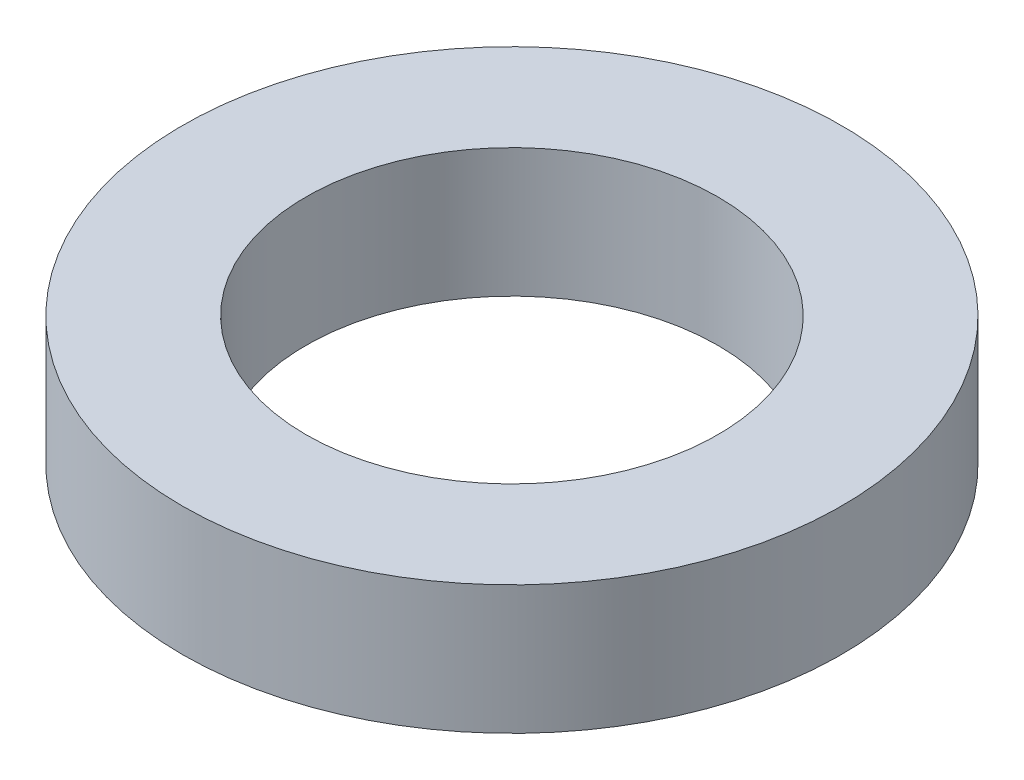
ISO-10303-21;
HEADER;
FILE_DESCRIPTION(('STEP AP214'),'2;1');
FILE_NAME('part.step','',(''),(''),'','','');
FILE_SCHEMA(('AUTOMOTIVE_DESIGN { 1 0 10303 214 1 1 1 1 }'));
ENDSEC;
DATA;
#1=APPLICATION_CONTEXT('core data for automotive mechanical design processes');
#2=APPLICATION_PROTOCOL_DEFINITION('international standard','automotive_design',2000,#1);
#3=PRODUCT_CONTEXT('',#1,'mechanical');
#4=PRODUCT('Part','Part','',(#3));
#5=PRODUCT_RELATED_PRODUCT_CATEGORY('part','',(#4));
#6=PRODUCT_DEFINITION_FORMATION('','',#4);
#7=PRODUCT_DEFINITION_CONTEXT('part definition',#1,'design');
#8=PRODUCT_DEFINITION('design','',#6,#7);
#9=PRODUCT_DEFINITION_SHAPE('','',#8);
#10=(LENGTH_UNIT() NAMED_UNIT(*) SI_UNIT(.MILLI.,.METRE.));
#11=(NAMED_UNIT(*) PLANE_ANGLE_UNIT() SI_UNIT($,.RADIAN.));
#12=(NAMED_UNIT(*) SI_UNIT($,.STERADIAN.) SOLID_ANGLE_UNIT());
#13=UNCERTAINTY_MEASURE_WITH_UNIT(LENGTH_MEASURE(1.E-05),#10,'distance_accuracy_value','');
#14=(GEOMETRIC_REPRESENTATION_CONTEXT(3) GLOBAL_UNCERTAINTY_ASSIGNED_CONTEXT((#13)) GLOBAL_UNIT_ASSIGNED_CONTEXT((#10,
#11,#12)) REPRESENTATION_CONTEXT('',''));
#15=CARTESIAN_POINT('',(0.,0.,0.));
#16=DIRECTION('',(0.,0.,1.));
#17=DIRECTION('',(1.,0.,0.));
#18=AXIS2_PLACEMENT_3D('',#15,#16,#17);
#19=CARTESIAN_POINT('',(0.,4.95665,0.));
#20=DIRECTION('',(0.,1.,0.));
#21=DIRECTION('',(0.,0.,1.));
#22=AXIS2_PLACEMENT_3D('',#19,#20,#21);
#23=PLANE('',#22);
#24=CARTESIAN_POINT('',(0.,4.95665,0.));
#25=DIRECTION('',(0.,1.,0.));
#26=DIRECTION('',(0.,0.,1.));
#27=AXIS2_PLACEMENT_3D('',#24,#25,#26);
#28=CIRCLE('',#27,12.7);
#29=CARTESIAN_POINT('',(0.,4.95665,12.7));
#30=VERTEX_POINT('',#29);
#31=EDGE_CURVE('E10',#30,#30,#28,.T.);
#32=ORIENTED_EDGE('',*,*,#31,.T.);
#33=EDGE_LOOP('',(#32));
#34=FACE_BOUND('',#33,.T.);
#35=CARTESIAN_POINT('',(0.,4.95665,0.));
#36=DIRECTION('',(0.,1.,0.));
#37=DIRECTION('',(0.,0.,1.));
#38=AXIS2_PLACEMENT_3D('',#35,#36,#37);
#39=CIRCLE('',#38,7.9375);
#40=CARTESIAN_POINT('',(0.,4.95665,7.9375));
#41=VERTEX_POINT('',#40);
#42=EDGE_CURVE('E42',#41,#41,#39,.T.);
#43=ORIENTED_EDGE('',*,*,#42,.F.);
#44=EDGE_LOOP('',(#43));
#45=FACE_BOUND('',#44,.T.);
#46=ADVANCED_FACE('F31',(#34,#45),#23,.T.);
#47=CARTESIAN_POINT('',(0.,0.,0.));
#48=DIRECTION('',(0.,1.,0.));
#49=DIRECTION('',(0.,0.,1.));
#50=AXIS2_PLACEMENT_3D('',#47,#48,#49);
#51=PLANE('',#50);
#52=CARTESIAN_POINT('',(0.,0.,0.));
#53=DIRECTION('',(0.,1.,0.));
#54=DIRECTION('',(0.,0.,1.));
#55=AXIS2_PLACEMENT_3D('',#52,#53,#54);
#56=CIRCLE('',#55,12.7);
#57=CARTESIAN_POINT('',(0.,0.,12.7));
#58=VERTEX_POINT('',#57);
#59=EDGE_CURVE('E35',#58,#58,#56,.T.);
#60=ORIENTED_EDGE('',*,*,#59,.F.);
#61=EDGE_LOOP('',(#60));
#62=FACE_BOUND('',#61,.T.);
#63=CARTESIAN_POINT('',(0.,0.,0.));
#64=DIRECTION('',(0.,1.,0.));
#65=DIRECTION('',(0.,0.,1.));
#66=AXIS2_PLACEMENT_3D('',#63,#64,#65);
#67=CIRCLE('',#66,7.9375);
#68=CARTESIAN_POINT('',(0.,0.,7.9375));
#69=VERTEX_POINT('',#68);
#70=EDGE_CURVE('E44',#69,#69,#67,.T.);
#71=ORIENTED_EDGE('',*,*,#70,.T.);
#72=EDGE_LOOP('',(#71));
#73=FACE_BOUND('',#72,.T.);
#74=ADVANCED_FACE('F54',(#62,#73),#51,.F.);
#75=CARTESIAN_POINT('',(0.,4.95665,0.));
#76=DIRECTION('',(0.,-1.,0.));
#77=DIRECTION('',(0.,0.,-1.));
#78=AXIS2_PLACEMENT_3D('',#75,#76,#77);
#79=CYLINDRICAL_SURFACE('',#78,12.7);
#80=ORIENTED_EDGE('',*,*,#31,.F.);
#81=EDGE_LOOP('',(#80));
#82=FACE_BOUND('',#81,.T.);
#83=ORIENTED_EDGE('',*,*,#59,.T.);
#84=EDGE_LOOP('',(#83));
#85=FACE_BOUND('',#84,.T.);
#86=ADVANCED_FACE('F33',(#82,#85),#79,.T.);
#87=CARTESIAN_POINT('',(0.,4.95665,0.));
#88=DIRECTION('',(0.,-1.,0.));
#89=DIRECTION('',(0.,0.,-1.));
#90=AXIS2_PLACEMENT_3D('',#87,#88,#89);
#91=CYLINDRICAL_SURFACE('',#90,7.9375);
#92=ORIENTED_EDGE('',*,*,#42,.T.);
#93=EDGE_LOOP('',(#92));
#94=FACE_BOUND('',#93,.T.);
#95=ORIENTED_EDGE('',*,*,#70,.F.);
#96=EDGE_LOOP('',(#95));
#97=FACE_BOUND('',#96,.T.);
#98=ADVANCED_FACE('F50',(#94,#97),#91,.F.);
#99=CLOSED_SHELL('',(#46,#74,#86,#98));
#100=MANIFOLD_SOLID_BREP('B2',#99);
#101=ADVANCED_BREP_SHAPE_REPRESENTATION('',(#18,#100),#14);
#102=SHAPE_DEFINITION_REPRESENTATION(#9,#101);
ENDSEC;
END-ISO-10303-21;
